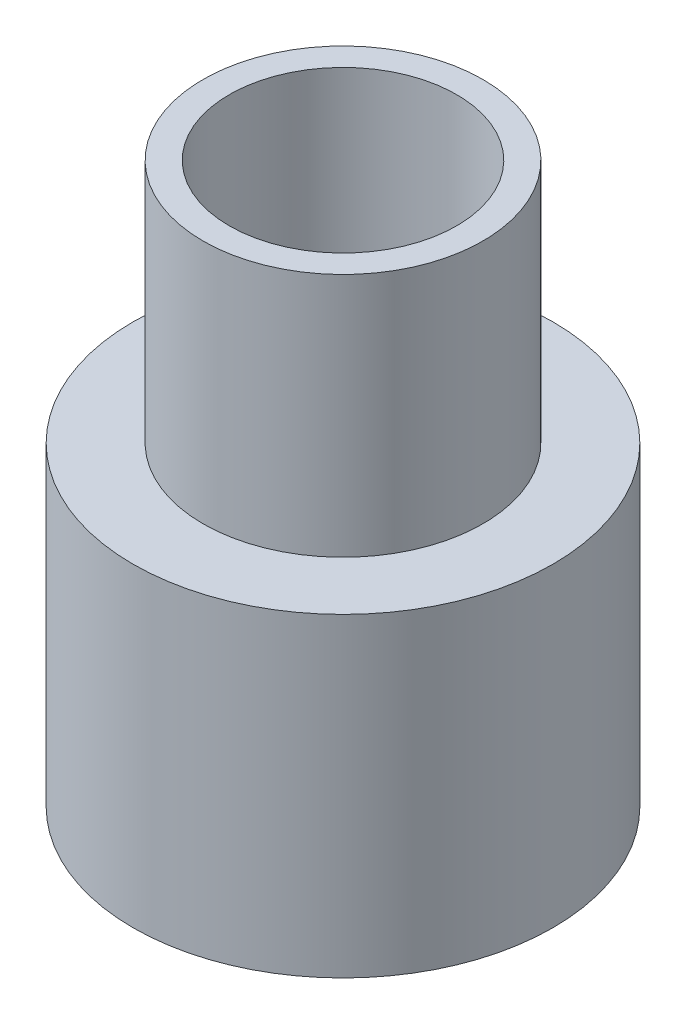
ISO-10303-21;
HEADER;
FILE_DESCRIPTION(('STEP AP214'),'2;1');
FILE_NAME('part.step','',(''),(''),'','','');
FILE_SCHEMA(('AUTOMOTIVE_DESIGN { 1 0 10303 214 1 1 1 1 }'));
ENDSEC;
DATA;
#1=APPLICATION_CONTEXT('core data for automotive mechanical design processes');
#2=APPLICATION_PROTOCOL_DEFINITION('international standard','automotive_design',2000,#1);
#3=PRODUCT_CONTEXT('',#1,'mechanical');
#4=PRODUCT('Part','Part','',(#3));
#5=PRODUCT_RELATED_PRODUCT_CATEGORY('part','',(#4));
#6=PRODUCT_DEFINITION_FORMATION('','',#4);
#7=PRODUCT_DEFINITION_CONTEXT('part definition',#1,'design');
#8=PRODUCT_DEFINITION('design','',#6,#7);
#9=PRODUCT_DEFINITION_SHAPE('','',#8);
#10=(LENGTH_UNIT() NAMED_UNIT(*) SI_UNIT(.MILLI.,.METRE.));
#11=(NAMED_UNIT(*) PLANE_ANGLE_UNIT() SI_UNIT($,.RADIAN.));
#12=(NAMED_UNIT(*) SI_UNIT($,.STERADIAN.) SOLID_ANGLE_UNIT());
#13=UNCERTAINTY_MEASURE_WITH_UNIT(LENGTH_MEASURE(1.E-05),#10,'distance_accuracy_value','');
#14=(GEOMETRIC_REPRESENTATION_CONTEXT(3) GLOBAL_UNCERTAINTY_ASSIGNED_CONTEXT((#13)) GLOBAL_UNIT_ASSIGNED_CONTEXT((#10,
#11,#12)) REPRESENTATION_CONTEXT('',''));
#15=CARTESIAN_POINT('',(0.,0.,0.));
#16=DIRECTION('',(0.,0.,1.));
#17=DIRECTION('',(1.,0.,0.));
#18=AXIS2_PLACEMENT_3D('',#15,#16,#17);
#19=CARTESIAN_POINT('',(0.,9.,0.));
#20=DIRECTION('',(0.,1.,0.));
#21=DIRECTION('',(0.,0.,1.));
#22=AXIS2_PLACEMENT_3D('',#19,#20,#21);
#23=PLANE('',#22);
#24=CARTESIAN_POINT('',(0.,9.,0.));
#25=DIRECTION('',(0.,1.,0.));
#26=DIRECTION('',(0.,0.,1.));
#27=AXIS2_PLACEMENT_3D('',#24,#25,#26);
#28=CIRCLE('',#27,6.);
#29=CARTESIAN_POINT('',(0.,9.,6.));
#30=VERTEX_POINT('',#29);
#31=EDGE_CURVE('E10',#30,#30,#28,.T.);
#32=ORIENTED_EDGE('',*,*,#31,.T.);
#33=EDGE_LOOP('',(#32));
#34=FACE_BOUND('',#33,.T.);
#35=CARTESIAN_POINT('',(0.,9.,0.));
#36=DIRECTION('',(0.,1.,0.));
#37=DIRECTION('',(0.,0.,1.));
#38=AXIS2_PLACEMENT_3D('',#35,#36,#37);
#39=CIRCLE('',#38,4.);
#40=CARTESIAN_POINT('',(0.,9.,4.));
#41=VERTEX_POINT('',#40);
#42=EDGE_CURVE('E53',#41,#41,#39,.T.);
#43=ORIENTED_EDGE('',*,*,#42,.F.);
#44=EDGE_LOOP('',(#43));
#45=FACE_BOUND('',#44,.T.);
#46=ADVANCED_FACE('F37',(#34,#45),#23,.T.);
#47=CARTESIAN_POINT('',(0.,0.,0.));
#48=DIRECTION('',(0.,1.,0.));
#49=DIRECTION('',(0.,0.,1.));
#50=AXIS2_PLACEMENT_3D('',#47,#48,#49);
#51=PLANE('',#50);
#52=CARTESIAN_POINT('',(0.,0.,0.));
#53=DIRECTION('',(0.,1.,0.));
#54=DIRECTION('',(0.,0.,1.));
#55=AXIS2_PLACEMENT_3D('',#52,#53,#54);
#56=CIRCLE('',#55,6.);
#57=CARTESIAN_POINT('',(0.,0.,6.));
#58=VERTEX_POINT('',#57);
#59=EDGE_CURVE('E41',#58,#58,#56,.T.);
#60=ORIENTED_EDGE('',*,*,#59,.F.);
#61=EDGE_LOOP('',(#60));
#62=FACE_BOUND('',#61,.T.);
#63=CARTESIAN_POINT('',(0.,0.,0.));
#64=DIRECTION('',(0.,1.,0.));
#65=DIRECTION('',(0.,0.,1.));
#66=AXIS2_PLACEMENT_3D('',#63,#64,#65);
#67=CIRCLE('',#66,3.25);
#68=CARTESIAN_POINT('',(0.,0.,3.25));
#69=VERTEX_POINT('',#68);
#70=EDGE_CURVE('E48',#69,#69,#67,.T.);
#71=ORIENTED_EDGE('',*,*,#70,.T.);
#72=EDGE_LOOP('',(#71));
#73=FACE_BOUND('',#72,.T.);
#74=ADVANCED_FACE('F78',(#62,#73),#51,.F.);
#75=CARTESIAN_POINT('',(0.,9.,0.));
#76=DIRECTION('',(0.,-1.,0.));
#77=DIRECTION('',(0.,0.,-1.));
#78=AXIS2_PLACEMENT_3D('',#75,#76,#77);
#79=CYLINDRICAL_SURFACE('',#78,6.);
#80=ORIENTED_EDGE('',*,*,#31,.F.);
#81=EDGE_LOOP('',(#80));
#82=FACE_BOUND('',#81,.T.);
#83=ORIENTED_EDGE('',*,*,#59,.T.);
#84=EDGE_LOOP('',(#83));
#85=FACE_BOUND('',#84,.T.);
#86=ADVANCED_FACE('F39',(#82,#85),#79,.T.);
#87=CARTESIAN_POINT('',(0.,9.,0.));
#88=DIRECTION('',(0.,-1.,0.));
#89=DIRECTION('',(0.,0.,-1.));
#90=AXIS2_PLACEMENT_3D('',#87,#88,#89);
#91=CYLINDRICAL_SURFACE('',#90,3.25);
#92=ORIENTED_EDGE('',*,*,#70,.F.);
#93=EDGE_LOOP('',(#92));
#94=FACE_BOUND('',#93,.T.);
#95=CARTESIAN_POINT('',(0.,16.,0.));
#96=DIRECTION('',(0.,1.,0.));
#97=DIRECTION('',(0.,0.,1.));
#98=AXIS2_PLACEMENT_3D('',#95,#96,#97);
#99=CIRCLE('',#98,3.25);
#100=CARTESIAN_POINT('',(0.,16.,3.25));
#101=VERTEX_POINT('',#100);
#102=EDGE_CURVE('E56',#101,#101,#99,.T.);
#103=ORIENTED_EDGE('',*,*,#102,.T.);
#104=EDGE_LOOP('',(#103));
#105=FACE_BOUND('',#104,.T.);
#106=ADVANCED_FACE('F62',(#94,#105),#91,.F.);
#107=CARTESIAN_POINT('',(0.,16.,0.));
#108=DIRECTION('',(0.,1.,0.));
#109=DIRECTION('',(0.,0.,1.));
#110=AXIS2_PLACEMENT_3D('',#107,#108,#109);
#111=PLANE('',#110);
#112=CARTESIAN_POINT('',(0.,16.,0.));
#113=DIRECTION('',(0.,1.,0.));
#114=DIRECTION('',(0.,0.,1.));
#115=AXIS2_PLACEMENT_3D('',#112,#113,#114);
#116=CIRCLE('',#115,4.);
#117=CARTESIAN_POINT('',(0.,16.,4.));
#118=VERTEX_POINT('',#117);
#119=EDGE_CURVE('E52',#118,#118,#116,.T.);
#120=ORIENTED_EDGE('',*,*,#119,.T.);
#121=EDGE_LOOP('',(#120));
#122=FACE_BOUND('',#121,.T.);
#123=ORIENTED_EDGE('',*,*,#102,.F.);
#124=EDGE_LOOP('',(#123));
#125=FACE_BOUND('',#124,.T.);
#126=ADVANCED_FACE('F64',(#122,#125),#111,.T.);
#127=CARTESIAN_POINT('',(0.,16.,0.));
#128=DIRECTION('',(0.,-1.,0.));
#129=DIRECTION('',(0.,0.,-1.));
#130=AXIS2_PLACEMENT_3D('',#127,#128,#129);
#131=CYLINDRICAL_SURFACE('',#130,4.);
#132=ORIENTED_EDGE('',*,*,#119,.F.);
#133=EDGE_LOOP('',(#132));
#134=FACE_BOUND('',#133,.T.);
#135=ORIENTED_EDGE('',*,*,#42,.T.);
#136=EDGE_LOOP('',(#135));
#137=FACE_BOUND('',#136,.T.);
#138=ADVANCED_FACE('F66',(#134,#137),#131,.T.);
#139=CLOSED_SHELL('',(#46,#74,#86,#106,#126,#138));
#140=MANIFOLD_SOLID_BREP('B2',#139);
#141=ADVANCED_BREP_SHAPE_REPRESENTATION('',(#18,#140),#14);
#142=SHAPE_DEFINITION_REPRESENTATION(#9,#141);
ENDSEC;
END-ISO-10303-21;
